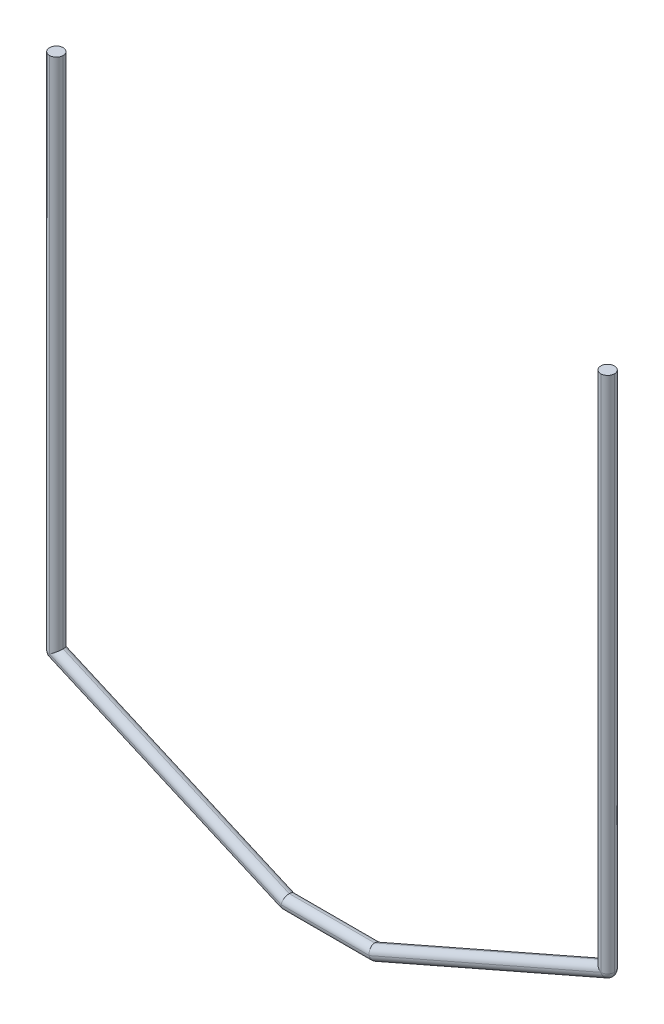
ISO-10303-21;
HEADER;
FILE_DESCRIPTION(('STEP AP214'),'2;1');
FILE_NAME('part.step','',(''),(''),'','','');
FILE_SCHEMA(('AUTOMOTIVE_DESIGN { 1 0 10303 214 1 1 1 1 }'));
ENDSEC;
DATA;
#1=APPLICATION_CONTEXT('core data for automotive mechanical design processes');
#2=APPLICATION_PROTOCOL_DEFINITION('international standard','automotive_design',2000,#1);
#3=PRODUCT_CONTEXT('',#1,'mechanical');
#4=PRODUCT('Part','Part','',(#3));
#5=PRODUCT_RELATED_PRODUCT_CATEGORY('part','',(#4));
#6=PRODUCT_DEFINITION_FORMATION('','',#4);
#7=PRODUCT_DEFINITION_CONTEXT('part definition',#1,'design');
#8=PRODUCT_DEFINITION('design','',#6,#7);
#9=PRODUCT_DEFINITION_SHAPE('','',#8);
#10=(LENGTH_UNIT() NAMED_UNIT(*) SI_UNIT(.MILLI.,.METRE.));
#11=(NAMED_UNIT(*) PLANE_ANGLE_UNIT() SI_UNIT($,.RADIAN.));
#12=(NAMED_UNIT(*) SI_UNIT($,.STERADIAN.) SOLID_ANGLE_UNIT());
#13=UNCERTAINTY_MEASURE_WITH_UNIT(LENGTH_MEASURE(1.E-05),#10,'distance_accuracy_value','');
#14=(GEOMETRIC_REPRESENTATION_CONTEXT(3) GLOBAL_UNCERTAINTY_ASSIGNED_CONTEXT((#13)) GLOBAL_UNIT_ASSIGNED_CONTEXT((#10,
#11,#12)) REPRESENTATION_CONTEXT('',''));
#15=CARTESIAN_POINT('',(0.,0.,0.));
#16=DIRECTION('',(0.,0.,1.));
#17=DIRECTION('',(1.,0.,0.));
#18=AXIS2_PLACEMENT_3D('',#15,#16,#17);
#19=CARTESIAN_POINT('',(0.,142.5,3.));
#20=DIRECTION('',(0.,1.,0.));
#21=DIRECTION('',(0.,0.,1.));
#22=AXIS2_PLACEMENT_3D('',#19,#20,#21);
#23=PLANE('',#22);
#24=CARTESIAN_POINT('',(-60.5,142.5,1.5));
#25=DIRECTION('',(0.,1.,0.));
#26=DIRECTION('',(0.,0.,1.));
#27=AXIS2_PLACEMENT_3D('',#24,#25,#26);
#28=CIRCLE('',#27,1.5);
#29=CARTESIAN_POINT('',(-59.,142.5,1.5));
#30=VERTEX_POINT('',#29);
#31=CARTESIAN_POINT('',(-60.5,142.5,0.));
#32=VERTEX_POINT('',#31);
#33=EDGE_CURVE('E204',#30,#32,#28,.T.);
#34=ORIENTED_EDGE('',*,*,#33,.T.);
#35=CARTESIAN_POINT('',(-60.5,142.5,1.5));
#36=DIRECTION('',(0.,1.,0.));
#37=DIRECTION('',(0.,0.,1.));
#38=AXIS2_PLACEMENT_3D('',#35,#36,#37);
#39=CIRCLE('',#38,1.5);
#40=CARTESIAN_POINT('',(-62.,142.5,1.5));
#41=VERTEX_POINT('',#40);
#42=EDGE_CURVE('E217',#32,#41,#39,.T.);
#43=ORIENTED_EDGE('',*,*,#42,.T.);
#44=CARTESIAN_POINT('',(-60.5,142.5,1.5));
#45=DIRECTION('',(0.,1.,0.));
#46=DIRECTION('',(0.,0.,1.));
#47=AXIS2_PLACEMENT_3D('',#44,#45,#46);
#48=CIRCLE('',#47,1.5);
#49=CARTESIAN_POINT('',(-60.5,142.5,3.));
#50=VERTEX_POINT('',#49);
#51=EDGE_CURVE('E201',#41,#50,#48,.T.);
#52=ORIENTED_EDGE('',*,*,#51,.T.);
#53=CARTESIAN_POINT('',(-60.5,142.5,1.5));
#54=DIRECTION('',(0.,1.,0.));
#55=DIRECTION('',(0.,0.,1.));
#56=AXIS2_PLACEMENT_3D('',#53,#54,#55);
#57=CIRCLE('',#56,1.5);
#58=EDGE_CURVE('E198',#50,#30,#57,.T.);
#59=ORIENTED_EDGE('',*,*,#58,.T.);
#60=EDGE_LOOP('',(#34,#43,#52,#59));
#61=FACE_BOUND('',#60,.T.);
#62=ADVANCED_FACE('F43',(#61),#23,.T.);
#63=CARTESIAN_POINT('',(0.,142.5,3.));
#64=DIRECTION('',(0.,-1.,0.));
#65=DIRECTION('',(0.,0.,-1.));
#66=AXIS2_PLACEMENT_3D('',#63,#64,#65);
#67=PLANE('',#66);
#68=CARTESIAN_POINT('',(60.5,142.5,1.5));
#69=DIRECTION('',(0.,-1.,0.));
#70=DIRECTION('',(0.,0.,-1.));
#71=AXIS2_PLACEMENT_3D('',#68,#69,#70);
#72=CIRCLE('',#71,1.5);
#73=CARTESIAN_POINT('',(62.,142.5,1.5));
#74=VERTEX_POINT('',#73);
#75=CARTESIAN_POINT('',(60.5,142.5,0.));
#76=VERTEX_POINT('',#75);
#77=EDGE_CURVE('E146',#74,#76,#72,.F.);
#78=ORIENTED_EDGE('',*,*,#77,.T.);
#79=CARTESIAN_POINT('',(60.5,142.5,1.5));
#80=DIRECTION('',(0.,-1.,0.));
#81=DIRECTION('',(0.,0.,-1.));
#82=AXIS2_PLACEMENT_3D('',#79,#80,#81);
#83=CIRCLE('',#82,1.5);
#84=CARTESIAN_POINT('',(59.,142.5,1.5));
#85=VERTEX_POINT('',#84);
#86=EDGE_CURVE('E150',#76,#85,#83,.F.);
#87=ORIENTED_EDGE('',*,*,#86,.T.);
#88=CARTESIAN_POINT('',(60.5,142.5,1.5));
#89=DIRECTION('',(0.,-1.,0.));
#90=DIRECTION('',(0.,0.,-1.));
#91=AXIS2_PLACEMENT_3D('',#88,#89,#90);
#92=CIRCLE('',#91,1.5);
#93=CARTESIAN_POINT('',(60.5,142.5,3.));
#94=VERTEX_POINT('',#93);
#95=EDGE_CURVE('E289',#85,#94,#92,.F.);
#96=ORIENTED_EDGE('',*,*,#95,.T.);
#97=CARTESIAN_POINT('',(60.5,142.5,1.5));
#98=DIRECTION('',(0.,-1.,0.));
#99=DIRECTION('',(0.,0.,-1.));
#100=AXIS2_PLACEMENT_3D('',#97,#98,#99);
#101=CIRCLE('',#100,1.5);
#102=EDGE_CURVE('E152',#94,#74,#101,.F.);
#103=ORIENTED_EDGE('',*,*,#102,.T.);
#104=EDGE_LOOP('',(#78,#87,#96,#103));
#105=FACE_BOUND('',#104,.T.);
#106=ADVANCED_FACE('F148',(#105),#67,.F.);
#107=CARTESIAN_POINT('',(-60.5,0.,1.5));
#108=DIRECTION('',(0.,1.,0.));
#109=DIRECTION('',(0.,0.,1.));
#110=AXIS2_PLACEMENT_3D('',#107,#108,#109);
#111=CYLINDRICAL_SURFACE('',#110,1.5);
#112=DIRECTION('',(0.,1.,0.));
#113=VECTOR('',#112,1.);
#114=CARTESIAN_POINT('',(-62.,0.,1.5));
#115=LINE('',#114,#113);
#116=CARTESIAN_POINT('',(-62.,28.7310233621787,1.5));
#117=VERTEX_POINT('',#116);
#118=EDGE_CURVE('E207',#117,#41,#115,.T.);
#119=ORIENTED_EDGE('',*,*,#118,.F.);
#120=CARTESIAN_POINT('',(-60.5,28.7310233621787,1.5));
#121=DIRECTION('',(0.,1.,0.));
#122=DIRECTION('',(0.,0.,1.));
#123=AXIS2_PLACEMENT_3D('',#120,#121,#122);
#124=CIRCLE('',#123,1.5);
#125=CARTESIAN_POINT('',(-60.5,28.7310233621787,3.));
#126=VERTEX_POINT('',#125);
#127=EDGE_CURVE('E333',#117,#126,#124,.T.);
#128=ORIENTED_EDGE('',*,*,#127,.T.);
#129=DIRECTION('',(0.,1.,0.));
#130=VECTOR('',#129,1.);
#131=CARTESIAN_POINT('',(-60.5,0.,3.));
#132=LINE('',#131,#130);
#133=EDGE_CURVE('E285',#50,#126,#132,.F.);
#134=ORIENTED_EDGE('',*,*,#133,.F.);
#135=ORIENTED_EDGE('',*,*,#51,.F.);
#136=EDGE_LOOP('',(#119,#128,#134,#135));
#137=FACE_BOUND('',#136,.T.);
#138=ADVANCED_FACE('F394',(#137),#111,.T.);
#139=CARTESIAN_POINT('',(0.830736447750872,1.89882616628771,1.5));
#140=DIRECTION('',(-0.916157334902189,0.400818834019708,0.));
#141=DIRECTION('',(-0.400818834019708,-0.916157334902189,0.));
#142=AXIS2_PLACEMENT_3D('',#139,#140,#141);
#143=CYLINDRICAL_SURFACE('',#142,1.5);
#144=DIRECTION('',(0.916157334902189,-0.400818834019708,0.));
#145=VECTOR('',#144,1.);
#146=CARTESIAN_POINT('',(-9.39877174897044,6.37423600235328,3.));
#147=LINE('',#146,#145);
#148=CARTESIAN_POINT('',(-9.68623231501998,6.49999999999999,3.));
#149=VERTEX_POINT('',#148);
#150=EDGE_CURVE('E281',#126,#149,#147,.T.);
#151=ORIENTED_EDGE('',*,*,#150,.F.);
#152=CARTESIAN_POINT('',(-60.5,28.7310233621787,1.5));
#153=DIRECTION('',(-0.916157334902189,0.400818834019708,0.));
#154=DIRECTION('',(-0.400818834019708,-0.916157334902189,0.));
#155=AXIS2_PLACEMENT_3D('',#152,#153,#154);
#156=CIRCLE('',#155,1.5);
#157=CARTESIAN_POINT('',(-61.1012282510296,27.3567873598254,1.5));
#158=VERTEX_POINT('',#157);
#159=EDGE_CURVE('E329',#126,#158,#156,.F.);
#160=ORIENTED_EDGE('',*,*,#159,.T.);
#161=DIRECTION('',(0.916157334902189,-0.400818834019708,0.));
#162=VECTOR('',#161,1.);
#163=CARTESIAN_POINT('',(-62.,27.75,1.5));
#164=LINE('',#163,#162);
#165=CARTESIAN_POINT('',(-10.2874605660496,5.12576399764671,1.5));
#166=VERTEX_POINT('',#165);
#167=EDGE_CURVE('E213',#166,#158,#164,.F.);
#168=ORIENTED_EDGE('',*,*,#167,.F.);
#169=CARTESIAN_POINT('',(-9.68623231502007,6.5,1.5));
#170=DIRECTION('',(-0.916157334902189,0.400818834019708,0.));
#171=DIRECTION('',(-0.400818834019708,-0.916157334902189,0.));
#172=AXIS2_PLACEMENT_3D('',#169,#170,#171);
#173=CIRCLE('',#172,1.5);
#174=EDGE_CURVE('E307',#166,#149,#173,.T.);
#175=ORIENTED_EDGE('',*,*,#174,.T.);
#176=EDGE_LOOP('',(#151,#160,#168,#175));
#177=FACE_BOUND('',#176,.T.);
#178=ADVANCED_FACE('F361',(#177),#143,.T.);
#179=CARTESIAN_POINT('',(-60.5,0.,1.5));
#180=DIRECTION('',(0.,-1.,0.));
#181=DIRECTION('',(0.,0.,-1.));
#182=AXIS2_PLACEMENT_3D('',#179,#180,#181);
#183=CYLINDRICAL_SURFACE('',#182,1.5);
#184=ORIENTED_EDGE('',*,*,#58,.F.);
#185=ORIENTED_EDGE('',*,*,#133,.T.);
#186=CARTESIAN_POINT('',(-60.5,28.7310233621787,1.5));
#187=DIRECTION('',(0.547348685017281,-0.836904664229955,0.));
#188=DIRECTION('',(-0.836904664229955,-0.547348685017281,0.));
#189=AXIS2_PLACEMENT_3D('',#186,#187,#188);
#190=ELLIPSE('',#189,1.79231884360468,1.5);
#191=CARTESIAN_POINT('',(-59.,29.7120467243574,1.5));
#192=VERTEX_POINT('',#191);
#193=EDGE_CURVE('E277',#192,#126,#190,.T.);
#194=ORIENTED_EDGE('',*,*,#193,.F.);
#195=DIRECTION('',(0.,-1.,0.));
#196=VECTOR('',#195,1.);
#197=CARTESIAN_POINT('',(-59.,0.,1.5));
#198=LINE('',#197,#196);
#199=EDGE_CURVE('E273',#30,#192,#198,.T.);
#200=ORIENTED_EDGE('',*,*,#199,.F.);
#201=EDGE_LOOP('',(#184,#185,#194,#200));
#202=FACE_BOUND('',#201,.T.);
#203=ADVANCED_FACE('F390',(#202),#183,.T.);
#204=CARTESIAN_POINT('',(0.,6.5,1.5));
#205=DIRECTION('',(-1.,0.,0.));
#206=DIRECTION('',(0.,-1.,0.));
#207=AXIS2_PLACEMENT_3D('',#204,#205,#206);
#208=CYLINDRICAL_SURFACE('',#207,1.5);
#209=DIRECTION('',(1.,0.,0.));
#210=VECTOR('',#209,1.);
#211=CARTESIAN_POINT('',(10.,6.5,3.));
#212=LINE('',#211,#210);
#213=CARTESIAN_POINT('',(9.68623231502011,6.5,3.));
#214=VERTEX_POINT('',#213);
#215=EDGE_CURVE('E269',#149,#214,#212,.T.);
#216=ORIENTED_EDGE('',*,*,#215,.F.);
#217=CARTESIAN_POINT('',(-9.68623231502007,6.5,1.5));
#218=DIRECTION('',(-1.,0.,0.));
#219=DIRECTION('',(0.,-1.,0.));
#220=AXIS2_PLACEMENT_3D('',#217,#218,#219);
#221=CIRCLE('',#220,1.5);
#222=CARTESIAN_POINT('',(-9.68623231502007,5.,1.5));
#223=VERTEX_POINT('',#222);
#224=EDGE_CURVE('E53',#149,#223,#221,.F.);
#225=ORIENTED_EDGE('',*,*,#224,.T.);
#226=DIRECTION('',(1.,0.,0.));
#227=VECTOR('',#226,1.);
#228=CARTESIAN_POINT('',(-10.,5.,1.5));
#229=LINE('',#228,#227);
#230=CARTESIAN_POINT('',(9.68623231502008,5.,1.5));
#231=VERTEX_POINT('',#230);
#232=EDGE_CURVE('E210',#231,#223,#229,.F.);
#233=ORIENTED_EDGE('',*,*,#232,.F.);
#234=CARTESIAN_POINT('',(9.68623231502008,6.5,1.5));
#235=DIRECTION('',(-1.,0.,0.));
#236=DIRECTION('',(0.,-1.,0.));
#237=AXIS2_PLACEMENT_3D('',#234,#235,#236);
#238=CIRCLE('',#237,1.5);
#239=EDGE_CURVE('E304',#231,#214,#238,.T.);
#240=ORIENTED_EDGE('',*,*,#239,.T.);
#241=EDGE_LOOP('',(#216,#225,#233,#240));
#242=FACE_BOUND('',#241,.T.);
#243=ADVANCED_FACE('F366',(#242),#208,.T.);
#244=CARTESIAN_POINT('',(0.830736447750889,1.89882616628775,1.5));
#245=DIRECTION('',(0.91615733490219,-0.400818834019707,0.));
#246=DIRECTION('',(0.400818834019707,0.916157334902189,0.));
#247=AXIS2_PLACEMENT_3D('',#244,#245,#246);
#248=CYLINDRICAL_SURFACE('',#247,1.5);
#249=ORIENTED_EDGE('',*,*,#193,.T.);
#250=ORIENTED_EDGE('',*,*,#150,.T.);
#251=CARTESIAN_POINT('',(-9.68623231501998,6.5,1.5));
#252=DIRECTION('',(0.978814930132911,-0.204746996434393,0.));
#253=DIRECTION('',(0.204746996434392,0.978814930132911,0.));
#254=AXIS2_PLACEMENT_3D('',#251,#252,#253);
#255=ELLIPSE('',#254,1.53246538627718,1.5);
#256=CARTESIAN_POINT('',(-9.37246463004005,7.99999999999999,1.5));
#257=VERTEX_POINT('',#256);
#258=EDGE_CURVE('E265',#257,#149,#255,.T.);
#259=ORIENTED_EDGE('',*,*,#258,.F.);
#260=DIRECTION('',(0.91615733490219,-0.400818834019707,0.));
#261=VECTOR('',#260,1.);
#262=CARTESIAN_POINT('',(1.43196469878045,3.27306216864103,1.5));
#263=LINE('',#262,#261);
#264=EDGE_CURVE('E261',#192,#257,#263,.T.);
#265=ORIENTED_EDGE('',*,*,#264,.F.);
#266=EDGE_LOOP('',(#249,#250,#259,#265));
#267=FACE_BOUND('',#266,.T.);
#268=ADVANCED_FACE('F363',(#267),#248,.T.);
#269=CARTESIAN_POINT('',(-60.5,0.,1.5));
#270=DIRECTION('',(0.,1.,0.));
#271=DIRECTION('',(0.,0.,1.));
#272=AXIS2_PLACEMENT_3D('',#269,#270,#271);
#273=CYLINDRICAL_SURFACE('',#272,1.5);
#274=ORIENTED_EDGE('',*,*,#33,.F.);
#275=ORIENTED_EDGE('',*,*,#199,.T.);
#276=CARTESIAN_POINT('',(-60.5,28.7310233621787,1.5));
#277=DIRECTION('',(-0.547348685017281,0.836904664229955,0.));
#278=DIRECTION('',(-0.836904664229955,-0.547348685017281,0.));
#279=AXIS2_PLACEMENT_3D('',#276,#277,#278);
#280=ELLIPSE('',#279,1.79231884360468,1.5);
#281=CARTESIAN_POINT('',(-60.5,28.7310233621787,0.));
#282=VERTEX_POINT('',#281);
#283=EDGE_CURVE('E257',#282,#192,#280,.F.);
#284=ORIENTED_EDGE('',*,*,#283,.F.);
#285=DIRECTION('',(0.,-1.,0.));
#286=VECTOR('',#285,1.);
#287=CARTESIAN_POINT('',(-60.5,29.7120467243574,0.));
#288=LINE('',#287,#286);
#289=EDGE_CURVE('E195',#32,#282,#288,.T.);
#290=ORIENTED_EDGE('',*,*,#289,.F.);
#291=EDGE_LOOP('',(#274,#275,#284,#290));
#292=FACE_BOUND('',#291,.T.);
#293=ADVANCED_FACE('F385',(#292),#273,.T.);
#294=CARTESIAN_POINT('',(0.,6.5,1.5));
#295=DIRECTION('',(1.,0.,0.));
#296=DIRECTION('',(0.,1.,0.));
#297=AXIS2_PLACEMENT_3D('',#294,#295,#296);
#298=CYLINDRICAL_SURFACE('',#297,1.5);
#299=ORIENTED_EDGE('',*,*,#258,.T.);
#300=ORIENTED_EDGE('',*,*,#215,.T.);
#301=CARTESIAN_POINT('',(9.68623231502011,6.5,1.5));
#302=DIRECTION('',(0.978814930132911,0.204746996434394,0.));
#303=DIRECTION('',(-0.204746996434393,0.978814930132911,0.));
#304=AXIS2_PLACEMENT_3D('',#301,#302,#303);
#305=ELLIPSE('',#304,1.53246538627718,1.5);
#306=CARTESIAN_POINT('',(9.37246463004019,8.,1.5));
#307=VERTEX_POINT('',#306);
#308=EDGE_CURVE('E253',#307,#214,#305,.T.);
#309=ORIENTED_EDGE('',*,*,#308,.F.);
#310=DIRECTION('',(1.,0.,0.));
#311=VECTOR('',#310,1.);
#312=CARTESIAN_POINT('',(0.,8.,1.5));
#313=LINE('',#312,#311);
#314=EDGE_CURVE('E249',#257,#307,#313,.T.);
#315=ORIENTED_EDGE('',*,*,#314,.F.);
#316=EDGE_LOOP('',(#299,#300,#309,#315));
#317=FACE_BOUND('',#316,.T.);
#318=ADVANCED_FACE('F370',(#317),#298,.T.);
#319=CARTESIAN_POINT('',(0.830736447750889,1.89882616628775,1.5));
#320=DIRECTION('',(-0.91615733490219,0.400818834019707,0.));
#321=DIRECTION('',(-0.400818834019707,-0.916157334902189,0.));
#322=AXIS2_PLACEMENT_3D('',#319,#320,#321);
#323=CYLINDRICAL_SURFACE('',#322,1.5);
#324=ORIENTED_EDGE('',*,*,#283,.T.);
#325=ORIENTED_EDGE('',*,*,#264,.T.);
#326=CARTESIAN_POINT('',(-9.68623231501998,6.5,1.5));
#327=DIRECTION('',(-0.978814930132911,0.204746996434393,0.));
#328=DIRECTION('',(-0.204746996434392,-0.978814930132911,0.));
#329=AXIS2_PLACEMENT_3D('',#326,#327,#328);
#330=ELLIPSE('',#329,1.53246538627718,1.5);
#331=CARTESIAN_POINT('',(-9.68623231501997,6.49999999999999,0.));
#332=VERTEX_POINT('',#331);
#333=EDGE_CURVE('E245',#332,#257,#330,.F.);
#334=ORIENTED_EDGE('',*,*,#333,.F.);
#335=DIRECTION('',(0.91615733490219,-0.400818834019707,0.));
#336=VECTOR('',#335,1.);
#337=CARTESIAN_POINT('',(-9.97369288106962,6.62576399764671,0.));
#338=LINE('',#337,#336);
#339=EDGE_CURVE('E191',#282,#332,#338,.T.);
#340=ORIENTED_EDGE('',*,*,#339,.F.);
#341=EDGE_LOOP('',(#324,#325,#334,#340));
#342=FACE_BOUND('',#341,.T.);
#343=ADVANCED_FACE('F379',(#342),#323,.T.);
#344=CARTESIAN_POINT('',(60.5,0.,1.5));
#345=DIRECTION('',(0.,-1.,0.));
#346=DIRECTION('',(0.,0.,-1.));
#347=AXIS2_PLACEMENT_3D('',#344,#345,#346);
#348=CYLINDRICAL_SURFACE('',#347,1.5);
#349=DIRECTION('',(0.,1.,0.));
#350=VECTOR('',#349,1.);
#351=CARTESIAN_POINT('',(60.5,142.5,3.));
#352=LINE('',#351,#350);
#353=CARTESIAN_POINT('',(60.5,28.7310233621787,3.));
#354=VERTEX_POINT('',#353);
#355=EDGE_CURVE('E238',#354,#94,#352,.T.);
#356=ORIENTED_EDGE('',*,*,#355,.F.);
#357=CARTESIAN_POINT('',(60.5,28.7310233621787,1.5));
#358=DIRECTION('',(0.,-1.,0.));
#359=DIRECTION('',(0.,0.,-1.));
#360=AXIS2_PLACEMENT_3D('',#357,#358,#359);
#361=CIRCLE('',#360,1.5);
#362=CARTESIAN_POINT('',(62.,28.7310233621787,1.5));
#363=VERTEX_POINT('',#362);
#364=EDGE_CURVE('E301',#354,#363,#361,.F.);
#365=ORIENTED_EDGE('',*,*,#364,.T.);
#366=DIRECTION('',(0.,1.,0.));
#367=VECTOR('',#366,1.);
#368=CARTESIAN_POINT('',(62.,27.75,1.5));
#369=LINE('',#368,#367);
#370=EDGE_CURVE('E242',#74,#363,#369,.F.);
#371=ORIENTED_EDGE('',*,*,#370,.F.);
#372=ORIENTED_EDGE('',*,*,#102,.F.);
#373=EDGE_LOOP('',(#356,#365,#371,#372));
#374=FACE_BOUND('',#373,.T.);
#375=ADVANCED_FACE('F439',(#374),#348,.T.);
#376=CARTESIAN_POINT('',(-0.830736447750866,1.89882616628769,1.5));
#377=DIRECTION('',(0.916157334902189,0.400818834019708,0.));
#378=DIRECTION('',(-0.400818834019708,0.916157334902189,0.));
#379=AXIS2_PLACEMENT_3D('',#376,#377,#378);
#380=CYLINDRICAL_SURFACE('',#379,1.5);
#381=ORIENTED_EDGE('',*,*,#308,.T.);
#382=DIRECTION('',(0.916157334902189,0.400818834019708,0.));
#383=VECTOR('',#382,1.);
#384=CARTESIAN_POINT('',(-0.830736447750866,1.89882616628769,3.));
#385=LINE('',#384,#383);
#386=EDGE_CURVE('E176',#354,#214,#385,.F.);
#387=ORIENTED_EDGE('',*,*,#386,.F.);
#388=CARTESIAN_POINT('',(60.5,28.7310233621787,1.5));
#389=DIRECTION('',(0.54734868501728,0.836904664229955,0.));
#390=DIRECTION('',(-0.836904664229955,0.54734868501728,0.));
#391=AXIS2_PLACEMENT_3D('',#388,#389,#390);
#392=ELLIPSE('',#391,1.79231884360468,1.5);
#393=CARTESIAN_POINT('',(59.,29.7120467243574,1.5));
#394=VERTEX_POINT('',#393);
#395=EDGE_CURVE('E235',#394,#354,#392,.T.);
#396=ORIENTED_EDGE('',*,*,#395,.F.);
#397=DIRECTION('',(0.916157334902189,0.400818834019708,0.));
#398=VECTOR('',#397,1.);
#399=CARTESIAN_POINT('',(-1.43196469878043,3.27306216864098,1.5));
#400=LINE('',#399,#398);
#401=EDGE_CURVE('E231',#307,#394,#400,.T.);
#402=ORIENTED_EDGE('',*,*,#401,.F.);
#403=EDGE_LOOP('',(#381,#387,#396,#402));
#404=FACE_BOUND('',#403,.T.);
#405=ADVANCED_FACE('F436',(#404),#380,.T.);
#406=CARTESIAN_POINT('',(0.,6.5,1.5));
#407=DIRECTION('',(-1.,0.,0.));
#408=DIRECTION('',(0.,-1.,0.));
#409=AXIS2_PLACEMENT_3D('',#406,#407,#408);
#410=CYLINDRICAL_SURFACE('',#409,1.5);
#411=ORIENTED_EDGE('',*,*,#333,.T.);
#412=ORIENTED_EDGE('',*,*,#314,.T.);
#413=CARTESIAN_POINT('',(9.68623231502011,6.5,1.5));
#414=DIRECTION('',(-0.978814930132911,-0.204746996434394,0.));
#415=DIRECTION('',(0.204746996434393,-0.978814930132911,0.));
#416=AXIS2_PLACEMENT_3D('',#413,#414,#415);
#417=ELLIPSE('',#416,1.53246538627718,1.5);
#418=CARTESIAN_POINT('',(9.6862323150201,6.50000000000001,0.));
#419=VERTEX_POINT('',#418);
#420=EDGE_CURVE('E227',#419,#307,#417,.F.);
#421=ORIENTED_EDGE('',*,*,#420,.F.);
#422=DIRECTION('',(1.,0.,0.));
#423=VECTOR('',#422,1.);
#424=CARTESIAN_POINT('',(9.37246463004019,6.5,0.));
#425=LINE('',#424,#423);
#426=EDGE_CURVE('E187',#332,#419,#425,.T.);
#427=ORIENTED_EDGE('',*,*,#426,.F.);
#428=EDGE_LOOP('',(#411,#412,#421,#427));
#429=FACE_BOUND('',#428,.T.);
#430=ADVANCED_FACE('F376',(#429),#410,.T.);
#431=CARTESIAN_POINT('',(-0.830736447750873,1.89882616628771,1.5));
#432=DIRECTION('',(0.916157334902189,0.400818834019708,0.));
#433=DIRECTION('',(-0.400818834019708,0.916157334902189,0.));
#434=AXIS2_PLACEMENT_3D('',#431,#432,#433);
#435=CYLINDRICAL_SURFACE('',#434,1.5);
#436=DIRECTION('',(-0.916157334902189,-0.400818834019708,0.));
#437=VECTOR('',#436,1.);
#438=CARTESIAN_POINT('',(9.39877174897044,6.37423600235329,0.));
#439=LINE('',#438,#437);
#440=CARTESIAN_POINT('',(60.5,28.7310233621787,0.));
#441=VERTEX_POINT('',#440);
#442=EDGE_CURVE('E169',#441,#419,#439,.T.);
#443=ORIENTED_EDGE('',*,*,#442,.F.);
#444=CARTESIAN_POINT('',(60.5,28.7310233621787,1.5));
#445=DIRECTION('',(0.916157334902189,0.400818834019708,0.));
#446=DIRECTION('',(-0.400818834019708,0.916157334902189,0.));
#447=AXIS2_PLACEMENT_3D('',#444,#445,#446);
#448=CIRCLE('',#447,1.5);
#449=CARTESIAN_POINT('',(61.1012282510296,27.3567873598254,1.5));
#450=VERTEX_POINT('',#449);
#451=EDGE_CURVE('E298',#441,#450,#448,.F.);
#452=ORIENTED_EDGE('',*,*,#451,.T.);
#453=DIRECTION('',(-0.916157334902189,-0.400818834019708,0.));
#454=VECTOR('',#453,1.);
#455=CARTESIAN_POINT('',(62.,27.75,1.5));
#456=LINE('',#455,#454);
#457=CARTESIAN_POINT('',(10.2874605660496,5.12576399764671,1.5));
#458=VERTEX_POINT('',#457);
#459=EDGE_CURVE('E180',#458,#450,#456,.F.);
#460=ORIENTED_EDGE('',*,*,#459,.F.);
#461=CARTESIAN_POINT('',(9.68623231502008,6.5,1.5));
#462=DIRECTION('',(0.916157334902189,0.400818834019708,0.));
#463=DIRECTION('',(-0.400818834019708,0.916157334902189,0.));
#464=AXIS2_PLACEMENT_3D('',#461,#462,#463);
#465=CIRCLE('',#464,1.5);
#466=EDGE_CURVE('E295',#458,#419,#465,.T.);
#467=ORIENTED_EDGE('',*,*,#466,.T.);
#468=EDGE_LOOP('',(#443,#452,#460,#467));
#469=FACE_BOUND('',#468,.T.);
#470=ADVANCED_FACE('F430',(#469),#435,.T.);
#471=CARTESIAN_POINT('',(60.5,0.,1.5));
#472=DIRECTION('',(0.,1.,0.));
#473=DIRECTION('',(0.,0.,1.));
#474=AXIS2_PLACEMENT_3D('',#471,#472,#473);
#475=CYLINDRICAL_SURFACE('',#474,1.5);
#476=ORIENTED_EDGE('',*,*,#370,.T.);
#477=CARTESIAN_POINT('',(60.5,28.7310233621787,1.5));
#478=DIRECTION('',(0.,1.,0.));
#479=DIRECTION('',(0.,0.,1.));
#480=AXIS2_PLACEMENT_3D('',#477,#478,#479);
#481=CIRCLE('',#480,1.5);
#482=EDGE_CURVE('E163',#363,#441,#481,.T.);
#483=ORIENTED_EDGE('',*,*,#482,.T.);
#484=DIRECTION('',(0.,1.,0.));
#485=VECTOR('',#484,1.);
#486=CARTESIAN_POINT('',(60.5,0.,0.));
#487=LINE('',#486,#485);
#488=EDGE_CURVE('E160',#76,#441,#487,.F.);
#489=ORIENTED_EDGE('',*,*,#488,.F.);
#490=ORIENTED_EDGE('',*,*,#77,.F.);
#491=EDGE_LOOP('',(#476,#483,#489,#490));
#492=FACE_BOUND('',#491,.T.);
#493=ADVANCED_FACE('F161',(#492),#475,.T.);
#494=CARTESIAN_POINT('',(60.5,0.,1.5));
#495=DIRECTION('',(0.,1.,0.));
#496=DIRECTION('',(0.,0.,1.));
#497=AXIS2_PLACEMENT_3D('',#494,#495,#496);
#498=CYLINDRICAL_SURFACE('',#497,1.5);
#499=ORIENTED_EDGE('',*,*,#355,.T.);
#500=ORIENTED_EDGE('',*,*,#95,.F.);
#501=DIRECTION('',(0.,-1.,0.));
#502=VECTOR('',#501,1.);
#503=CARTESIAN_POINT('',(59.,142.5,1.5));
#504=LINE('',#503,#502);
#505=EDGE_CURVE('E170',#394,#85,#504,.F.);
#506=ORIENTED_EDGE('',*,*,#505,.F.);
#507=ORIENTED_EDGE('',*,*,#395,.T.);
#508=EDGE_LOOP('',(#499,#500,#506,#507));
#509=FACE_BOUND('',#508,.T.);
#510=ADVANCED_FACE('F423',(#509),#498,.T.);
#511=CARTESIAN_POINT('',(-0.830736447750866,1.89882616628769,1.5));
#512=DIRECTION('',(-0.916157334902189,-0.400818834019708,0.));
#513=DIRECTION('',(0.400818834019708,-0.916157334902189,0.));
#514=AXIS2_PLACEMENT_3D('',#511,#512,#513);
#515=CYLINDRICAL_SURFACE('',#514,1.5);
#516=ORIENTED_EDGE('',*,*,#420,.T.);
#517=ORIENTED_EDGE('',*,*,#401,.T.);
#518=CARTESIAN_POINT('',(60.5,28.7310233621787,1.5));
#519=DIRECTION('',(-0.54734868501728,-0.836904664229955,0.));
#520=DIRECTION('',(0.836904664229955,-0.54734868501728,0.));
#521=AXIS2_PLACEMENT_3D('',#518,#519,#520);
#522=ELLIPSE('',#521,1.79231884360468,1.5);
#523=EDGE_CURVE('E218',#441,#394,#522,.F.);
#524=ORIENTED_EDGE('',*,*,#523,.F.);
#525=ORIENTED_EDGE('',*,*,#442,.T.);
#526=EDGE_LOOP('',(#516,#517,#524,#525));
#527=FACE_BOUND('',#526,.T.);
#528=ADVANCED_FACE('F420',(#527),#515,.T.);
#529=CARTESIAN_POINT('',(60.5,0.,1.5));
#530=DIRECTION('',(0.,-1.,0.));
#531=DIRECTION('',(0.,0.,-1.));
#532=AXIS2_PLACEMENT_3D('',#529,#530,#531);
#533=CYLINDRICAL_SURFACE('',#532,1.5);
#534=ORIENTED_EDGE('',*,*,#86,.F.);
#535=ORIENTED_EDGE('',*,*,#488,.T.);
#536=ORIENTED_EDGE('',*,*,#523,.T.);
#537=ORIENTED_EDGE('',*,*,#505,.T.);
#538=EDGE_LOOP('',(#534,#535,#536,#537));
#539=FACE_BOUND('',#538,.T.);
#540=ADVANCED_FACE('F172',(#539),#533,.T.);
#541=CARTESIAN_POINT('',(-60.5,0.,1.5));
#542=DIRECTION('',(0.,-1.,0.));
#543=DIRECTION('',(0.,0.,-1.));
#544=AXIS2_PLACEMENT_3D('',#541,#542,#543);
#545=CYLINDRICAL_SURFACE('',#544,1.5);
#546=ORIENTED_EDGE('',*,*,#289,.T.);
#547=CARTESIAN_POINT('',(-60.5,28.7310233621787,1.5));
#548=DIRECTION('',(0.,-1.,0.));
#549=DIRECTION('',(0.,0.,-1.));
#550=AXIS2_PLACEMENT_3D('',#547,#548,#549);
#551=CIRCLE('',#550,1.5);
#552=EDGE_CURVE('E68',#282,#117,#551,.F.);
#553=ORIENTED_EDGE('',*,*,#552,.T.);
#554=ORIENTED_EDGE('',*,*,#118,.T.);
#555=ORIENTED_EDGE('',*,*,#42,.F.);
#556=EDGE_LOOP('',(#546,#553,#554,#555));
#557=FACE_BOUND('',#556,.T.);
#558=ADVANCED_FACE('F419',(#557),#545,.T.);
#559=CARTESIAN_POINT('',(0.,6.5,1.5));
#560=DIRECTION('',(1.,0.,0.));
#561=DIRECTION('',(0.,1.,0.));
#562=AXIS2_PLACEMENT_3D('',#559,#560,#561);
#563=CYLINDRICAL_SURFACE('',#562,1.5);
#564=ORIENTED_EDGE('',*,*,#232,.T.);
#565=CARTESIAN_POINT('',(-9.68623231502007,6.5,1.5));
#566=DIRECTION('',(1.,0.,0.));
#567=DIRECTION('',(0.,1.,0.));
#568=AXIS2_PLACEMENT_3D('',#565,#566,#567);
#569=CIRCLE('',#568,1.5);
#570=EDGE_CURVE('E11',#223,#332,#569,.T.);
#571=ORIENTED_EDGE('',*,*,#570,.T.);
#572=ORIENTED_EDGE('',*,*,#426,.T.);
#573=CARTESIAN_POINT('',(9.68623231502008,6.5,1.5));
#574=DIRECTION('',(1.,0.,0.));
#575=DIRECTION('',(0.,0.,-1.));
#576=AXIS2_PLACEMENT_3D('',#573,#574,#575);
#577=CIRCLE('',#576,1.5);
#578=EDGE_CURVE('E221',#231,#419,#577,.T.);
#579=ORIENTED_EDGE('',*,*,#578,.F.);
#580=EDGE_LOOP('',(#564,#571,#572,#579));
#581=FACE_BOUND('',#580,.T.);
#582=ADVANCED_FACE('F462',(#581),#563,.T.);
#583=CARTESIAN_POINT('',(9.68623231502008,6.5,1.5));
#584=DIRECTION('',(0.,1.,0.));
#585=DIRECTION('',(-1.,0.,0.));
#586=AXIS2_PLACEMENT_3D('',#583,#584,#585);
#587=SPHERICAL_SURFACE('',#586,1.5);
#588=CARTESIAN_POINT('',(9.68623231502008,6.5,1.5));
#589=DIRECTION('',(0.,0.,1.));
#590=DIRECTION('',(1.,0.,0.));
#591=AXIS2_PLACEMENT_3D('',#588,#589,#590);
#592=CIRCLE('',#591,1.5);
#593=EDGE_CURVE('E320',#231,#458,#592,.T.);
#594=ORIENTED_EDGE('',*,*,#593,.F.);
#595=ORIENTED_EDGE('',*,*,#578,.T.);
#596=ORIENTED_EDGE('',*,*,#466,.F.);
#597=EDGE_LOOP('',(#594,#595,#596));
#598=FACE_BOUND('',#597,.T.);
#599=ADVANCED_FACE('F478',(#598),#587,.T.);
#600=CARTESIAN_POINT('',(9.68623231502008,6.5,1.5));
#601=DIRECTION('',(0.400818834019708,-0.916157334902189,0.));
#602=DIRECTION('',(0.916157334902189,0.400818834019708,0.));
#603=AXIS2_PLACEMENT_3D('',#600,#601,#602);
#604=SPHERICAL_SURFACE('',#603,1.5);
#605=ORIENTED_EDGE('',*,*,#239,.F.);
#606=ORIENTED_EDGE('',*,*,#593,.T.);
#607=CARTESIAN_POINT('',(9.68623231502008,6.5,1.5));
#608=DIRECTION('',(0.916157334902189,0.400818834019708,0.));
#609=DIRECTION('',(-0.400818834019708,0.916157334902189,0.));
#610=AXIS2_PLACEMENT_3D('',#607,#608,#609);
#611=CIRCLE('',#610,1.5);
#612=EDGE_CURVE('E316',#214,#458,#611,.T.);
#613=ORIENTED_EDGE('',*,*,#612,.F.);
#614=EDGE_LOOP('',(#605,#606,#613));
#615=FACE_BOUND('',#614,.T.);
#616=ADVANCED_FACE('F474',(#615),#604,.T.);
#617=CARTESIAN_POINT('',(-0.830736447750873,1.89882616628771,1.5));
#618=DIRECTION('',(-0.916157334902189,-0.400818834019708,0.));
#619=DIRECTION('',(0.400818834019708,-0.916157334902189,0.));
#620=AXIS2_PLACEMENT_3D('',#617,#618,#619);
#621=CYLINDRICAL_SURFACE('',#620,1.5);
#622=CARTESIAN_POINT('',(60.5,28.7310233621787,1.5));
#623=DIRECTION('',(0.91615733490219,0.400818834019707,0.));
#624=DIRECTION('',(-0.400818834019707,0.91615733490219,0.));
#625=AXIS2_PLACEMENT_3D('',#622,#623,#624);
#626=CIRCLE('',#625,1.5);
#627=EDGE_CURVE('E312',#354,#450,#626,.T.);
#628=ORIENTED_EDGE('',*,*,#627,.F.);
#629=ORIENTED_EDGE('',*,*,#386,.T.);
#630=ORIENTED_EDGE('',*,*,#612,.T.);
#631=ORIENTED_EDGE('',*,*,#459,.T.);
#632=EDGE_LOOP('',(#628,#629,#630,#631));
#633=FACE_BOUND('',#632,.T.);
#634=ADVANCED_FACE('F470',(#633),#621,.T.);
#635=CARTESIAN_POINT('',(60.5,28.7310233621787,1.5));
#636=DIRECTION('',(0.400818834019708,-0.916157334902189,0.));
#637=DIRECTION('',(0.916157334902189,0.400818834019708,0.));
#638=AXIS2_PLACEMENT_3D('',#635,#636,#637);
#639=SPHERICAL_SURFACE('',#638,1.5);
#640=ORIENTED_EDGE('',*,*,#364,.F.);
#641=ORIENTED_EDGE('',*,*,#627,.T.);
#642=CARTESIAN_POINT('',(60.5,28.7310233621787,1.5));
#643=DIRECTION('',(0.,0.,-1.));
#644=DIRECTION('',(-1.,0.,0.));
#645=AXIS2_PLACEMENT_3D('',#642,#643,#644);
#646=CIRCLE('',#645,1.5);
#647=EDGE_CURVE('E308',#363,#450,#646,.T.);
#648=ORIENTED_EDGE('',*,*,#647,.F.);
#649=EDGE_LOOP('',(#640,#641,#648));
#650=FACE_BOUND('',#649,.T.);
#651=ADVANCED_FACE('F466',(#650),#639,.T.);
#652=CARTESIAN_POINT('',(60.5,28.7310233621787,1.5));
#653=DIRECTION('',(0.,0.,1.));
#654=DIRECTION('',(1.,0.,0.));
#655=AXIS2_PLACEMENT_3D('',#652,#653,#654);
#656=SPHERICAL_SURFACE('',#655,1.5);
#657=ORIENTED_EDGE('',*,*,#647,.T.);
#658=ORIENTED_EDGE('',*,*,#451,.F.);
#659=ORIENTED_EDGE('',*,*,#482,.F.);
#660=EDGE_LOOP('',(#657,#658,#659));
#661=FACE_BOUND('',#660,.T.);
#662=ADVANCED_FACE('F463',(#661),#656,.T.);
#663=CARTESIAN_POINT('',(-9.68623231502007,6.5,1.5));
#664=DIRECTION('',(0.,0.,1.));
#665=DIRECTION('',(1.,0.,0.));
#666=AXIS2_PLACEMENT_3D('',#663,#664,#665);
#667=SPHERICAL_SURFACE('',#666,1.5);
#668=CARTESIAN_POINT('',(-9.68623231502007,6.5,1.5));
#669=DIRECTION('',(0.,0.,-1.));
#670=DIRECTION('',(-1.,0.,0.));
#671=AXIS2_PLACEMENT_3D('',#668,#669,#670);
#672=CIRCLE('',#671,1.5);
#673=EDGE_CURVE('E47',#223,#166,#672,.T.);
#674=ORIENTED_EDGE('',*,*,#673,.F.);
#675=ORIENTED_EDGE('',*,*,#224,.F.);
#676=ORIENTED_EDGE('',*,*,#174,.F.);
#677=EDGE_LOOP('',(#674,#675,#676));
#678=FACE_BOUND('',#677,.T.);
#679=ADVANCED_FACE('F45',(#678),#667,.T.);
#680=CARTESIAN_POINT('',(-9.68623231502007,6.5,1.5));
#681=DIRECTION('',(0.400818834019708,0.916157334902189,0.));
#682=DIRECTION('',(-0.916157334902189,0.400818834019708,0.));
#683=AXIS2_PLACEMENT_3D('',#680,#681,#682);
#684=SPHERICAL_SURFACE('',#683,1.5);
#685=ORIENTED_EDGE('',*,*,#570,.F.);
#686=ORIENTED_EDGE('',*,*,#673,.T.);
#687=CARTESIAN_POINT('',(-9.68623231502007,6.5,1.5));
#688=DIRECTION('',(-0.916157334902189,0.400818834019708,0.));
#689=DIRECTION('',(-0.400818834019708,-0.916157334902189,0.));
#690=AXIS2_PLACEMENT_3D('',#687,#688,#689);
#691=CIRCLE('',#690,1.5);
#692=EDGE_CURVE('E346',#332,#166,#691,.T.);
#693=ORIENTED_EDGE('',*,*,#692,.F.);
#694=EDGE_LOOP('',(#685,#686,#693));
#695=FACE_BOUND('',#694,.T.);
#696=ADVANCED_FACE('F356',(#695),#684,.T.);
#697=CARTESIAN_POINT('',(0.830736447750872,1.89882616628771,1.5));
#698=DIRECTION('',(0.916157334902189,-0.400818834019708,0.));
#699=DIRECTION('',(0.400818834019708,0.916157334902189,0.));
#700=AXIS2_PLACEMENT_3D('',#697,#698,#699);
#701=CYLINDRICAL_SURFACE('',#700,1.5);
#702=CARTESIAN_POINT('',(-60.5,28.7310233621787,1.5));
#703=DIRECTION('',(-0.91615733490219,0.400818834019707,0.));
#704=DIRECTION('',(-0.400818834019707,-0.91615733490219,0.));
#705=AXIS2_PLACEMENT_3D('',#702,#703,#704);
#706=CIRCLE('',#705,1.5);
#707=EDGE_CURVE('E343',#282,#158,#706,.T.);
#708=ORIENTED_EDGE('',*,*,#707,.F.);
#709=ORIENTED_EDGE('',*,*,#339,.T.);
#710=ORIENTED_EDGE('',*,*,#692,.T.);
#711=ORIENTED_EDGE('',*,*,#167,.T.);
#712=EDGE_LOOP('',(#708,#709,#710,#711));
#713=FACE_BOUND('',#712,.T.);
#714=ADVANCED_FACE('F401',(#713),#701,.T.);
#715=CARTESIAN_POINT('',(-60.5,28.7310233621787,1.5));
#716=DIRECTION('',(0.400818834019708,0.916157334902189,0.));
#717=DIRECTION('',(-0.916157334902189,0.400818834019708,0.));
#718=AXIS2_PLACEMENT_3D('',#715,#716,#717);
#719=SPHERICAL_SURFACE('',#718,1.5);
#720=ORIENTED_EDGE('',*,*,#552,.F.);
#721=ORIENTED_EDGE('',*,*,#707,.T.);
#722=CARTESIAN_POINT('',(-60.5,28.7310233621787,1.5));
#723=DIRECTION('',(0.,0.,1.));
#724=DIRECTION('',(1.,0.,0.));
#725=AXIS2_PLACEMENT_3D('',#722,#723,#724);
#726=CIRCLE('',#725,1.5);
#727=EDGE_CURVE('E340',#117,#158,#726,.T.);
#728=ORIENTED_EDGE('',*,*,#727,.F.);
#729=EDGE_LOOP('',(#720,#721,#728));
#730=FACE_BOUND('',#729,.T.);
#731=ADVANCED_FACE('F400',(#730),#719,.T.);
#732=CARTESIAN_POINT('',(-60.5,28.7310233621787,1.5));
#733=DIRECTION('',(0.,0.,1.));
#734=DIRECTION('',(1.,0.,0.));
#735=AXIS2_PLACEMENT_3D('',#732,#733,#734);
#736=SPHERICAL_SURFACE('',#735,1.5);
#737=ORIENTED_EDGE('',*,*,#159,.F.);
#738=ORIENTED_EDGE('',*,*,#127,.F.);
#739=ORIENTED_EDGE('',*,*,#727,.T.);
#740=EDGE_LOOP('',(#737,#738,#739));
#741=FACE_BOUND('',#740,.T.);
#742=ADVANCED_FACE('F398',(#741),#736,.T.);
#743=CLOSED_SHELL('',(#62,#106,#138,#178,#203,#243,#268,#293,#318,#343,#375,#405,#430,#470,#493,
#510,#528,#540,#558,#582,#599,#616,#634,#651,#662,#679,#696,#714,#731,#742));
#744=MANIFOLD_SOLID_BREP('B2',#743);
#745=ADVANCED_BREP_SHAPE_REPRESENTATION('',(#18,#744),#14);
#746=SHAPE_DEFINITION_REPRESENTATION(#9,#745);
ENDSEC;
END-ISO-10303-21;
